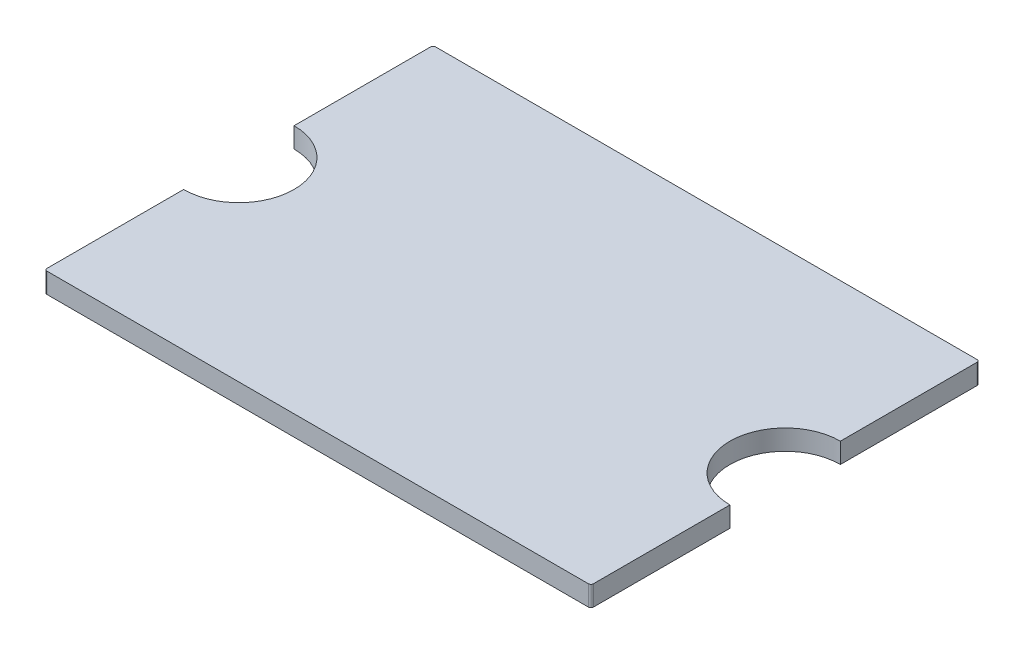
ISO-10303-21;
HEADER;
FILE_DESCRIPTION(('STEP AP214'),'2;1');
FILE_NAME('part.step','',(''),(''),'','','');
FILE_SCHEMA(('AUTOMOTIVE_DESIGN { 1 0 10303 214 1 1 1 1 }'));
ENDSEC;
DATA;
#1=APPLICATION_CONTEXT('core data for automotive mechanical design processes');
#2=APPLICATION_PROTOCOL_DEFINITION('international standard','automotive_design',2000,#1);
#3=PRODUCT_CONTEXT('',#1,'mechanical');
#4=PRODUCT('Part','Part','',(#3));
#5=PRODUCT_RELATED_PRODUCT_CATEGORY('part','',(#4));
#6=PRODUCT_DEFINITION_FORMATION('','',#4);
#7=PRODUCT_DEFINITION_CONTEXT('part definition',#1,'design');
#8=PRODUCT_DEFINITION('design','',#6,#7);
#9=PRODUCT_DEFINITION_SHAPE('','',#8);
#10=(LENGTH_UNIT() NAMED_UNIT(*) SI_UNIT(.MILLI.,.METRE.));
#11=(NAMED_UNIT(*) PLANE_ANGLE_UNIT() SI_UNIT($,.RADIAN.));
#12=(NAMED_UNIT(*) SI_UNIT($,.STERADIAN.) SOLID_ANGLE_UNIT());
#13=UNCERTAINTY_MEASURE_WITH_UNIT(LENGTH_MEASURE(1.E-05),#10,'distance_accuracy_value','');
#14=(GEOMETRIC_REPRESENTATION_CONTEXT(3) GLOBAL_UNCERTAINTY_ASSIGNED_CONTEXT((#13)) GLOBAL_UNIT_ASSIGNED_CONTEXT((#10,
#11,#12)) REPRESENTATION_CONTEXT('',''));
#15=CARTESIAN_POINT('',(0.,0.,0.));
#16=DIRECTION('',(0.,0.,1.));
#17=DIRECTION('',(1.,0.,0.));
#18=AXIS2_PLACEMENT_3D('',#15,#16,#17);
#19=CARTESIAN_POINT('',(2.25,0.0833333333333333,-1.6));
#20=DIRECTION('',(-1.,0.,0.));
#21=DIRECTION('',(0.,0.,1.));
#22=AXIS2_PLACEMENT_3D('',#19,#20,#21);
#23=PLANE('',#22);
#24=DIRECTION('',(0.,0.,-1.));
#25=VECTOR('',#24,1.);
#26=CARTESIAN_POINT('',(2.25,-0.0833333333333333,-1.6));
#27=LINE('',#26,#25);
#28=CARTESIAN_POINT('',(2.25,-0.0833333333333333,-0.455000000000001));
#29=VERTEX_POINT('',#28);
#30=CARTESIAN_POINT('',(2.25,-0.0833333333333333,-1.58));
#31=VERTEX_POINT('',#30);
#32=EDGE_CURVE('E11',#29,#31,#27,.T.);
#33=ORIENTED_EDGE('',*,*,#32,.T.);
#34=DIRECTION('',(0.,1.,0.));
#35=VECTOR('',#34,1.);
#36=CARTESIAN_POINT('',(2.25,0.0833333333333333,-1.58));
#37=LINE('',#36,#35);
#38=CARTESIAN_POINT('',(2.25,0.0833333333333333,-1.58));
#39=VERTEX_POINT('',#38);
#40=EDGE_CURVE('E24',#31,#39,#37,.T.);
#41=ORIENTED_EDGE('',*,*,#40,.T.);
#42=DIRECTION('',(0.,0.,-1.));
#43=VECTOR('',#42,1.);
#44=CARTESIAN_POINT('',(2.25,0.0833333333333333,-1.6));
#45=LINE('',#44,#43);
#46=CARTESIAN_POINT('',(2.25,0.0833333333333334,-0.455000000000001));
#47=VERTEX_POINT('',#46);
#48=EDGE_CURVE('E194',#47,#39,#45,.T.);
#49=ORIENTED_EDGE('',*,*,#48,.F.);
#50=DIRECTION('',(0.,-1.,0.));
#51=VECTOR('',#50,1.);
#52=CARTESIAN_POINT('',(2.25,1.,-0.455000000000001));
#53=LINE('',#52,#51);
#54=EDGE_CURVE('E192',#47,#29,#53,.T.);
#55=ORIENTED_EDGE('',*,*,#54,.T.);
#56=EDGE_LOOP('',(#33,#41,#49,#55));
#57=FACE_BOUND('',#56,.T.);
#58=ADVANCED_FACE('F17',(#57),#23,.F.);
#59=CARTESIAN_POINT('',(2.25,0.0833333333333333,-1.6));
#60=DIRECTION('',(-1.,0.,0.));
#61=DIRECTION('',(0.,0.,1.));
#62=AXIS2_PLACEMENT_3D('',#59,#60,#61);
#63=PLANE('',#62);
#64=DIRECTION('',(0.,0.,-1.));
#65=VECTOR('',#64,1.);
#66=CARTESIAN_POINT('',(2.25,0.0833333333333333,-1.6));
#67=LINE('',#66,#65);
#68=CARTESIAN_POINT('',(2.25,0.0833333333333333,1.58));
#69=VERTEX_POINT('',#68);
#70=CARTESIAN_POINT('',(2.25,0.0833333333333334,0.455));
#71=VERTEX_POINT('',#70);
#72=EDGE_CURVE('E190',#69,#71,#67,.T.);
#73=ORIENTED_EDGE('',*,*,#72,.F.);
#74=DIRECTION('',(0.,-1.,0.));
#75=VECTOR('',#74,1.);
#76=CARTESIAN_POINT('',(2.25,0.0833333333333333,1.58));
#77=LINE('',#76,#75);
#78=CARTESIAN_POINT('',(2.25,-0.0833333333333333,1.58));
#79=VERTEX_POINT('',#78);
#80=EDGE_CURVE('E188',#69,#79,#77,.T.);
#81=ORIENTED_EDGE('',*,*,#80,.T.);
#82=DIRECTION('',(0.,0.,-1.));
#83=VECTOR('',#82,1.);
#84=CARTESIAN_POINT('',(2.25,-0.0833333333333333,-1.6));
#85=LINE('',#84,#83);
#86=CARTESIAN_POINT('',(2.25,-0.0833333333333333,0.455));
#87=VERTEX_POINT('',#86);
#88=EDGE_CURVE('E186',#79,#87,#85,.T.);
#89=ORIENTED_EDGE('',*,*,#88,.T.);
#90=DIRECTION('',(0.,-1.,0.));
#91=VECTOR('',#90,1.);
#92=CARTESIAN_POINT('',(2.25,1.,0.455));
#93=LINE('',#92,#91);
#94=EDGE_CURVE('E183',#71,#87,#93,.T.);
#95=ORIENTED_EDGE('',*,*,#94,.F.);
#96=EDGE_LOOP('',(#73,#81,#89,#95));
#97=FACE_BOUND('',#96,.T.);
#98=ADVANCED_FACE('F243',(#97),#63,.F.);
#99=CARTESIAN_POINT('',(-2.25,0.0833333333333333,-1.6));
#100=DIRECTION('',(1.,0.,0.));
#101=DIRECTION('',(0.,0.,-1.));
#102=AXIS2_PLACEMENT_3D('',#99,#100,#101);
#103=PLANE('',#102);
#104=DIRECTION('',(0.,0.,1.));
#105=VECTOR('',#104,1.);
#106=CARTESIAN_POINT('',(-2.25,-0.0833333333333333,-1.6));
#107=LINE('',#106,#105);
#108=CARTESIAN_POINT('',(-2.25,-0.0833333333333333,0.455));
#109=VERTEX_POINT('',#108);
#110=CARTESIAN_POINT('',(-2.25,-0.0833333333333333,1.58));
#111=VERTEX_POINT('',#110);
#112=EDGE_CURVE('E181',#109,#111,#107,.T.);
#113=ORIENTED_EDGE('',*,*,#112,.T.);
#114=DIRECTION('',(0.,1.,0.));
#115=VECTOR('',#114,1.);
#116=CARTESIAN_POINT('',(-2.25,0.0833333333333333,1.58));
#117=LINE('',#116,#115);
#118=CARTESIAN_POINT('',(-2.25,0.0833333333333333,1.58));
#119=VERTEX_POINT('',#118);
#120=EDGE_CURVE('E179',#111,#119,#117,.T.);
#121=ORIENTED_EDGE('',*,*,#120,.T.);
#122=DIRECTION('',(0.,0.,1.));
#123=VECTOR('',#122,1.);
#124=CARTESIAN_POINT('',(-2.25,0.0833333333333333,-1.6));
#125=LINE('',#124,#123);
#126=CARTESIAN_POINT('',(-2.25,0.0833333333333334,0.455));
#127=VERTEX_POINT('',#126);
#128=EDGE_CURVE('E176',#127,#119,#125,.T.);
#129=ORIENTED_EDGE('',*,*,#128,.F.);
#130=DIRECTION('',(0.,-1.,0.));
#131=VECTOR('',#130,1.);
#132=CARTESIAN_POINT('',(-2.25,1.,0.455));
#133=LINE('',#132,#131);
#134=EDGE_CURVE('E173',#127,#109,#133,.T.);
#135=ORIENTED_EDGE('',*,*,#134,.T.);
#136=EDGE_LOOP('',(#113,#121,#129,#135));
#137=FACE_BOUND('',#136,.T.);
#138=ADVANCED_FACE('F222',(#137),#103,.F.);
#139=CARTESIAN_POINT('',(-2.25,0.0833333333333333,-1.6));
#140=DIRECTION('',(1.,0.,0.));
#141=DIRECTION('',(0.,0.,-1.));
#142=AXIS2_PLACEMENT_3D('',#139,#140,#141);
#143=PLANE('',#142);
#144=DIRECTION('',(0.,0.,1.));
#145=VECTOR('',#144,1.);
#146=CARTESIAN_POINT('',(-2.25,0.0833333333333333,-1.6));
#147=LINE('',#146,#145);
#148=CARTESIAN_POINT('',(-2.25,0.0833333333333333,-1.58));
#149=VERTEX_POINT('',#148);
#150=CARTESIAN_POINT('',(-2.25,0.0833333333333334,-0.455));
#151=VERTEX_POINT('',#150);
#152=EDGE_CURVE('E171',#149,#151,#147,.T.);
#153=ORIENTED_EDGE('',*,*,#152,.F.);
#154=DIRECTION('',(0.,-1.,0.));
#155=VECTOR('',#154,1.);
#156=CARTESIAN_POINT('',(-2.25,0.0833333333333333,-1.58));
#157=LINE('',#156,#155);
#158=CARTESIAN_POINT('',(-2.25,-0.0833333333333333,-1.58));
#159=VERTEX_POINT('',#158);
#160=EDGE_CURVE('E169',#149,#159,#157,.T.);
#161=ORIENTED_EDGE('',*,*,#160,.T.);
#162=DIRECTION('',(0.,0.,1.));
#163=VECTOR('',#162,1.);
#164=CARTESIAN_POINT('',(-2.25,-0.0833333333333333,-1.6));
#165=LINE('',#164,#163);
#166=CARTESIAN_POINT('',(-2.25,-0.0833333333333333,-0.455));
#167=VERTEX_POINT('',#166);
#168=EDGE_CURVE('E167',#159,#167,#165,.T.);
#169=ORIENTED_EDGE('',*,*,#168,.T.);
#170=DIRECTION('',(0.,-1.,0.));
#171=VECTOR('',#170,1.);
#172=CARTESIAN_POINT('',(-2.25,1.,-0.455));
#173=LINE('',#172,#171);
#174=EDGE_CURVE('E164',#151,#167,#173,.T.);
#175=ORIENTED_EDGE('',*,*,#174,.F.);
#176=EDGE_LOOP('',(#153,#161,#169,#175));
#177=FACE_BOUND('',#176,.T.);
#178=ADVANCED_FACE('F234',(#177),#143,.F.);
#179=CARTESIAN_POINT('',(2.25,0.0833333333333333,1.6));
#180=DIRECTION('',(0.,1.,0.));
#181=DIRECTION('',(0.,0.,1.));
#182=AXIS2_PLACEMENT_3D('',#179,#180,#181);
#183=PLANE('',#182);
#184=ORIENTED_EDGE('',*,*,#128,.T.);
#185=CARTESIAN_POINT('',(-2.23,0.0833333333333333,1.58));
#186=DIRECTION('',(0.,1.,0.));
#187=DIRECTION('',(0.,0.,1.));
#188=AXIS2_PLACEMENT_3D('',#185,#186,#187);
#189=CIRCLE('',#188,0.0200000000000001);
#190=CARTESIAN_POINT('',(-2.23,0.0833333333333333,1.6));
#191=VERTEX_POINT('',#190);
#192=EDGE_CURVE('E162',#119,#191,#189,.T.);
#193=ORIENTED_EDGE('',*,*,#192,.T.);
#194=DIRECTION('',(1.,0.,0.));
#195=VECTOR('',#194,1.);
#196=CARTESIAN_POINT('',(-2.25,0.0833333333333333,1.6));
#197=LINE('',#196,#195);
#198=CARTESIAN_POINT('',(2.23,0.0833333333333333,1.6));
#199=VERTEX_POINT('',#198);
#200=EDGE_CURVE('E160',#191,#199,#197,.T.);
#201=ORIENTED_EDGE('',*,*,#200,.T.);
#202=CARTESIAN_POINT('',(2.23,0.0833333333333333,1.58));
#203=DIRECTION('',(0.,1.,0.));
#204=DIRECTION('',(0.,0.,1.));
#205=AXIS2_PLACEMENT_3D('',#202,#203,#204);
#206=CIRCLE('',#205,0.0200000000000001);
#207=EDGE_CURVE('E157',#199,#69,#206,.T.);
#208=ORIENTED_EDGE('',*,*,#207,.T.);
#209=ORIENTED_EDGE('',*,*,#72,.T.);
#210=CARTESIAN_POINT('',(2.25,0.0833333333333334,0.));
#211=DIRECTION('',(0.,-1.,0.));
#212=DIRECTION('',(0.,0.,1.));
#213=AXIS2_PLACEMENT_3D('',#210,#211,#212);
#214=CIRCLE('',#213,0.455);
#215=EDGE_CURVE('E154',#71,#47,#214,.T.);
#216=ORIENTED_EDGE('',*,*,#215,.T.);
#217=ORIENTED_EDGE('',*,*,#48,.T.);
#218=CARTESIAN_POINT('',(2.23,0.0833333333333333,-1.58));
#219=DIRECTION('',(0.,1.,0.));
#220=DIRECTION('',(0.,0.,1.));
#221=AXIS2_PLACEMENT_3D('',#218,#219,#220);
#222=CIRCLE('',#221,0.0200000000000001);
#223=CARTESIAN_POINT('',(2.23,0.0833333333333333,-1.6));
#224=VERTEX_POINT('',#223);
#225=EDGE_CURVE('E152',#39,#224,#222,.T.);
#226=ORIENTED_EDGE('',*,*,#225,.T.);
#227=DIRECTION('',(-1.,0.,0.));
#228=VECTOR('',#227,1.);
#229=CARTESIAN_POINT('',(-2.25,0.0833333333333333,-1.6));
#230=LINE('',#229,#228);
#231=CARTESIAN_POINT('',(-2.23,0.0833333333333333,-1.6));
#232=VERTEX_POINT('',#231);
#233=EDGE_CURVE('E121',#224,#232,#230,.T.);
#234=ORIENTED_EDGE('',*,*,#233,.T.);
#235=CARTESIAN_POINT('',(-2.23,0.0833333333333333,-1.58));
#236=DIRECTION('',(0.,1.,0.));
#237=DIRECTION('',(0.,0.,1.));
#238=AXIS2_PLACEMENT_3D('',#235,#236,#237);
#239=CIRCLE('',#238,0.0200000000000001);
#240=EDGE_CURVE('E148',#232,#149,#239,.T.);
#241=ORIENTED_EDGE('',*,*,#240,.T.);
#242=ORIENTED_EDGE('',*,*,#152,.T.);
#243=CARTESIAN_POINT('',(-2.25,0.0833333333333334,0.));
#244=DIRECTION('',(0.,-1.,0.));
#245=DIRECTION('',(0.,0.,1.));
#246=AXIS2_PLACEMENT_3D('',#243,#244,#245);
#247=CIRCLE('',#246,0.455);
#248=EDGE_CURVE('E145',#151,#127,#247,.T.);
#249=ORIENTED_EDGE('',*,*,#248,.T.);
#250=EDGE_LOOP('',(#184,#193,#201,#208,#209,#216,#217,#226,#234,#241,#242,#249));
#251=FACE_BOUND('',#250,.T.);
#252=ADVANCED_FACE('F198',(#251),#183,.T.);
#253=CARTESIAN_POINT('',(2.25,-0.0833333333333333,1.6));
#254=DIRECTION('',(0.,1.,0.));
#255=DIRECTION('',(0.,0.,1.));
#256=AXIS2_PLACEMENT_3D('',#253,#254,#255);
#257=PLANE('',#256);
#258=DIRECTION('',(1.,0.,0.));
#259=VECTOR('',#258,1.);
#260=CARTESIAN_POINT('',(-2.25,-0.0833333333333333,1.6));
#261=LINE('',#260,#259);
#262=CARTESIAN_POINT('',(-2.23,-0.0833333333333333,1.6));
#263=VERTEX_POINT('',#262);
#264=CARTESIAN_POINT('',(2.23,-0.0833333333333333,1.6));
#265=VERTEX_POINT('',#264);
#266=EDGE_CURVE('E143',#263,#265,#261,.T.);
#267=ORIENTED_EDGE('',*,*,#266,.F.);
#268=CARTESIAN_POINT('',(-2.23,-0.0833333333333333,1.58));
#269=DIRECTION('',(0.,-1.,0.));
#270=DIRECTION('',(0.,0.,1.));
#271=AXIS2_PLACEMENT_3D('',#268,#269,#270);
#272=CIRCLE('',#271,0.0200000000000001);
#273=EDGE_CURVE('E140',#263,#111,#272,.T.);
#274=ORIENTED_EDGE('',*,*,#273,.T.);
#275=ORIENTED_EDGE('',*,*,#112,.F.);
#276=CARTESIAN_POINT('',(-2.25,-0.0833333333333333,0.));
#277=DIRECTION('',(0.,-1.,0.));
#278=DIRECTION('',(0.,0.,1.));
#279=AXIS2_PLACEMENT_3D('',#276,#277,#278);
#280=CIRCLE('',#279,0.455);
#281=EDGE_CURVE('E137',#167,#109,#280,.T.);
#282=ORIENTED_EDGE('',*,*,#281,.F.);
#283=ORIENTED_EDGE('',*,*,#168,.F.);
#284=CARTESIAN_POINT('',(-2.23,-0.0833333333333333,-1.58));
#285=DIRECTION('',(0.,-1.,0.));
#286=DIRECTION('',(0.,0.,1.));
#287=AXIS2_PLACEMENT_3D('',#284,#285,#286);
#288=CIRCLE('',#287,0.0200000000000001);
#289=CARTESIAN_POINT('',(-2.23,-0.0833333333333333,-1.6));
#290=VERTEX_POINT('',#289);
#291=EDGE_CURVE('E106',#159,#290,#288,.T.);
#292=ORIENTED_EDGE('',*,*,#291,.T.);
#293=DIRECTION('',(-1.,0.,0.));
#294=VECTOR('',#293,1.);
#295=CARTESIAN_POINT('',(-2.25,-0.0833333333333333,-1.6));
#296=LINE('',#295,#294);
#297=CARTESIAN_POINT('',(2.23,-0.0833333333333333,-1.6));
#298=VERTEX_POINT('',#297);
#299=EDGE_CURVE('E100',#298,#290,#296,.T.);
#300=ORIENTED_EDGE('',*,*,#299,.F.);
#301=CARTESIAN_POINT('',(2.23,-0.0833333333333333,-1.58));
#302=DIRECTION('',(0.,-1.,0.));
#303=DIRECTION('',(0.,0.,1.));
#304=AXIS2_PLACEMENT_3D('',#301,#302,#303);
#305=CIRCLE('',#304,0.0200000000000001);
#306=EDGE_CURVE('E103',#298,#31,#305,.T.);
#307=ORIENTED_EDGE('',*,*,#306,.T.);
#308=ORIENTED_EDGE('',*,*,#32,.F.);
#309=CARTESIAN_POINT('',(2.25,-0.0833333333333333,0.));
#310=DIRECTION('',(0.,-1.,0.));
#311=DIRECTION('',(0.,0.,1.));
#312=AXIS2_PLACEMENT_3D('',#309,#310,#311);
#313=CIRCLE('',#312,0.455);
#314=EDGE_CURVE('E117',#87,#29,#313,.T.);
#315=ORIENTED_EDGE('',*,*,#314,.F.);
#316=ORIENTED_EDGE('',*,*,#88,.F.);
#317=CARTESIAN_POINT('',(2.23,-0.0833333333333333,1.58));
#318=DIRECTION('',(0.,-1.,0.));
#319=DIRECTION('',(0.,0.,1.));
#320=AXIS2_PLACEMENT_3D('',#317,#318,#319);
#321=CIRCLE('',#320,0.0200000000000001);
#322=EDGE_CURVE('E125',#79,#265,#321,.T.);
#323=ORIENTED_EDGE('',*,*,#322,.T.);
#324=EDGE_LOOP('',(#267,#274,#275,#282,#283,#292,#300,#307,#308,#315,#316,#323));
#325=FACE_BOUND('',#324,.T.);
#326=ADVANCED_FACE('F102',(#325),#257,.F.);
#327=CARTESIAN_POINT('',(-2.25,0.0833333333333333,-1.6));
#328=DIRECTION('',(0.,0.,1.));
#329=DIRECTION('',(1.,0.,0.));
#330=AXIS2_PLACEMENT_3D('',#327,#328,#329);
#331=PLANE('',#330);
#332=ORIENTED_EDGE('',*,*,#299,.T.);
#333=DIRECTION('',(0.,1.,0.));
#334=VECTOR('',#333,1.);
#335=CARTESIAN_POINT('',(-2.23,0.0833333333333333,-1.6));
#336=LINE('',#335,#334);
#337=EDGE_CURVE('E122',#290,#232,#336,.T.);
#338=ORIENTED_EDGE('',*,*,#337,.T.);
#339=ORIENTED_EDGE('',*,*,#233,.F.);
#340=DIRECTION('',(0.,-1.,0.));
#341=VECTOR('',#340,1.);
#342=CARTESIAN_POINT('',(2.23,0.0833333333333333,-1.6));
#343=LINE('',#342,#341);
#344=EDGE_CURVE('E116',#224,#298,#343,.T.);
#345=ORIENTED_EDGE('',*,*,#344,.T.);
#346=EDGE_LOOP('',(#332,#338,#339,#345));
#347=FACE_BOUND('',#346,.T.);
#348=ADVANCED_FACE('F120',(#347),#331,.F.);
#349=CARTESIAN_POINT('',(-2.25,0.0833333333333333,1.6));
#350=DIRECTION('',(0.,0.,-1.));
#351=DIRECTION('',(-1.,0.,0.));
#352=AXIS2_PLACEMENT_3D('',#349,#350,#351);
#353=PLANE('',#352);
#354=ORIENTED_EDGE('',*,*,#200,.F.);
#355=DIRECTION('',(0.,-1.,0.));
#356=VECTOR('',#355,1.);
#357=CARTESIAN_POINT('',(-2.23,0.0833333333333333,1.6));
#358=LINE('',#357,#356);
#359=EDGE_CURVE('E123',#191,#263,#358,.T.);
#360=ORIENTED_EDGE('',*,*,#359,.T.);
#361=ORIENTED_EDGE('',*,*,#266,.T.);
#362=DIRECTION('',(0.,1.,0.));
#363=VECTOR('',#362,1.);
#364=CARTESIAN_POINT('',(2.23,0.0833333333333333,1.6));
#365=LINE('',#364,#363);
#366=EDGE_CURVE('E128',#265,#199,#365,.T.);
#367=ORIENTED_EDGE('',*,*,#366,.T.);
#368=EDGE_LOOP('',(#354,#360,#361,#367));
#369=FACE_BOUND('',#368,.T.);
#370=ADVANCED_FACE('F214',(#369),#353,.F.);
#371=CARTESIAN_POINT('',(2.25,1.,0.));
#372=DIRECTION('',(0.,-1.,0.));
#373=DIRECTION('',(0.,0.,-1.));
#374=AXIS2_PLACEMENT_3D('',#371,#372,#373);
#375=CYLINDRICAL_SURFACE('',#374,0.455);
#376=ORIENTED_EDGE('',*,*,#94,.T.);
#377=ORIENTED_EDGE('',*,*,#314,.T.);
#378=ORIENTED_EDGE('',*,*,#54,.F.);
#379=ORIENTED_EDGE('',*,*,#215,.F.);
#380=EDGE_LOOP('',(#376,#377,#378,#379));
#381=FACE_BOUND('',#380,.T.);
#382=ADVANCED_FACE('F202',(#381),#375,.F.);
#383=CARTESIAN_POINT('',(-2.25,1.,0.));
#384=DIRECTION('',(0.,-1.,0.));
#385=DIRECTION('',(0.,0.,-1.));
#386=AXIS2_PLACEMENT_3D('',#383,#384,#385);
#387=CYLINDRICAL_SURFACE('',#386,0.455);
#388=ORIENTED_EDGE('',*,*,#174,.T.);
#389=ORIENTED_EDGE('',*,*,#281,.T.);
#390=ORIENTED_EDGE('',*,*,#134,.F.);
#391=ORIENTED_EDGE('',*,*,#248,.F.);
#392=EDGE_LOOP('',(#388,#389,#390,#391));
#393=FACE_BOUND('',#392,.T.);
#394=ADVANCED_FACE('F227',(#393),#387,.F.);
#395=CARTESIAN_POINT('',(-2.23,0.0833333333333333,1.58));
#396=DIRECTION('',(0.,-1.,0.));
#397=DIRECTION('',(0.,0.,-1.));
#398=AXIS2_PLACEMENT_3D('',#395,#396,#397);
#399=CYLINDRICAL_SURFACE('',#398,0.0200000000000001);
#400=ORIENTED_EDGE('',*,*,#192,.F.);
#401=ORIENTED_EDGE('',*,*,#120,.F.);
#402=ORIENTED_EDGE('',*,*,#273,.F.);
#403=ORIENTED_EDGE('',*,*,#359,.F.);
#404=EDGE_LOOP('',(#400,#401,#402,#403));
#405=FACE_BOUND('',#404,.T.);
#406=ADVANCED_FACE('F220',(#405),#399,.T.);
#407=CARTESIAN_POINT('',(-2.23,0.0833333333333333,-1.58));
#408=DIRECTION('',(0.,-1.,0.));
#409=DIRECTION('',(0.,0.,-1.));
#410=AXIS2_PLACEMENT_3D('',#407,#408,#409);
#411=CYLINDRICAL_SURFACE('',#410,0.0200000000000001);
#412=ORIENTED_EDGE('',*,*,#240,.F.);
#413=ORIENTED_EDGE('',*,*,#337,.F.);
#414=ORIENTED_EDGE('',*,*,#291,.F.);
#415=ORIENTED_EDGE('',*,*,#160,.F.);
#416=EDGE_LOOP('',(#412,#413,#414,#415));
#417=FACE_BOUND('',#416,.T.);
#418=ADVANCED_FACE('F233',(#417),#411,.T.);
#419=CARTESIAN_POINT('',(2.23,0.0833333333333333,1.58));
#420=DIRECTION('',(0.,-1.,0.));
#421=DIRECTION('',(0.,0.,-1.));
#422=AXIS2_PLACEMENT_3D('',#419,#420,#421);
#423=CYLINDRICAL_SURFACE('',#422,0.0200000000000001);
#424=ORIENTED_EDGE('',*,*,#207,.F.);
#425=ORIENTED_EDGE('',*,*,#366,.F.);
#426=ORIENTED_EDGE('',*,*,#322,.F.);
#427=ORIENTED_EDGE('',*,*,#80,.F.);
#428=EDGE_LOOP('',(#424,#425,#426,#427));
#429=FACE_BOUND('',#428,.T.);
#430=ADVANCED_FACE('F210',(#429),#423,.T.);
#431=CARTESIAN_POINT('',(2.23,0.0833333333333333,-1.58));
#432=DIRECTION('',(0.,-1.,0.));
#433=DIRECTION('',(0.,0.,-1.));
#434=AXIS2_PLACEMENT_3D('',#431,#432,#433);
#435=CYLINDRICAL_SURFACE('',#434,0.0200000000000001);
#436=ORIENTED_EDGE('',*,*,#225,.F.);
#437=ORIENTED_EDGE('',*,*,#40,.F.);
#438=ORIENTED_EDGE('',*,*,#306,.F.);
#439=ORIENTED_EDGE('',*,*,#344,.F.);
#440=EDGE_LOOP('',(#436,#437,#438,#439));
#441=FACE_BOUND('',#440,.T.);
#442=ADVANCED_FACE('F115',(#441),#435,.T.);
#443=CLOSED_SHELL('',(#58,#98,#138,#178,#252,#326,#348,#370,#382,#394,#406,#418,#430,#442));
#444=MANIFOLD_SOLID_BREP('B1',#443);
#445=ADVANCED_BREP_SHAPE_REPRESENTATION('',(#18,#444),#14);
#446=SHAPE_DEFINITION_REPRESENTATION(#9,#445);
ENDSEC;
END-ISO-10303-21;
